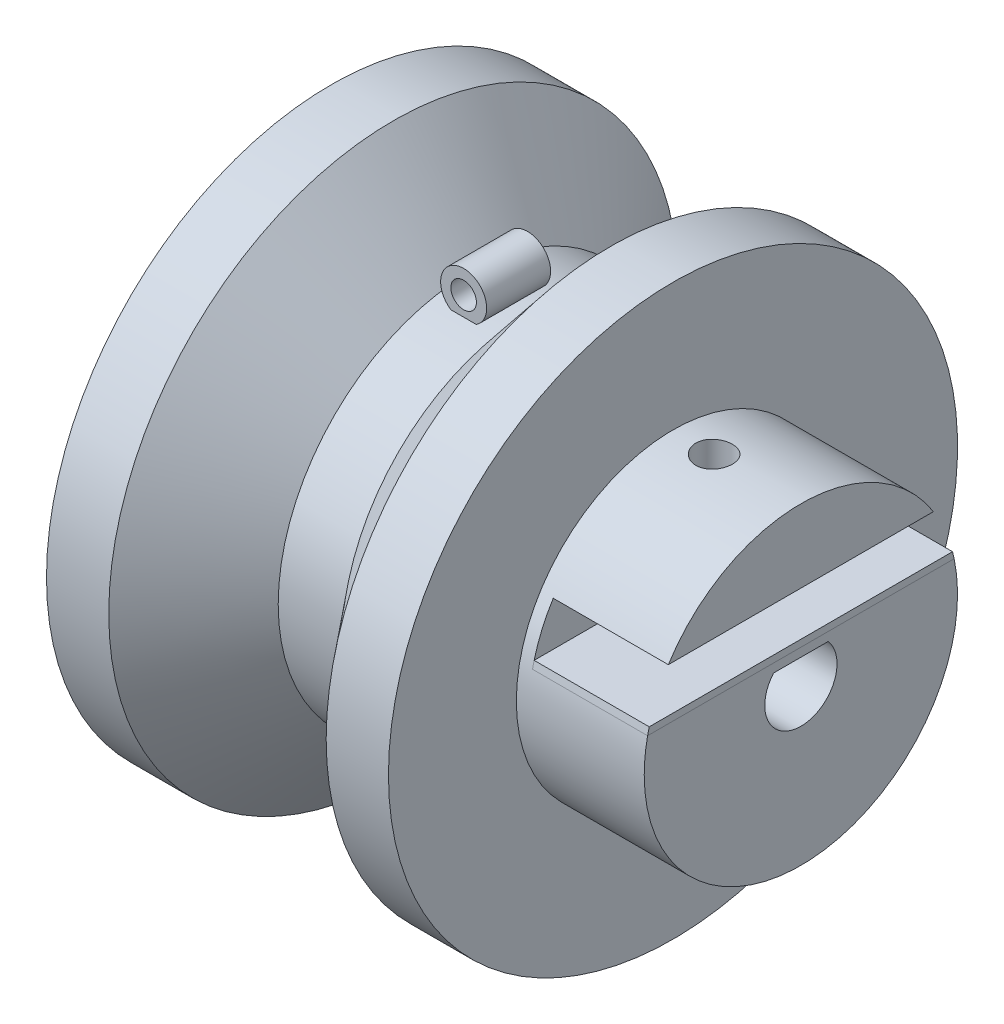
ISO-10303-21;
HEADER;
FILE_DESCRIPTION(('STEP AP214'),'2;1');
FILE_NAME('part.step','',(''),(''),'','','');
FILE_SCHEMA(('AUTOMOTIVE_DESIGN { 1 0 10303 214 1 1 1 1 }'));
ENDSEC;
DATA;
#1=APPLICATION_CONTEXT('core data for automotive mechanical design processes');
#2=APPLICATION_PROTOCOL_DEFINITION('international standard','automotive_design',2000,#1);
#3=PRODUCT_CONTEXT('',#1,'mechanical');
#4=PRODUCT('Part','Part','',(#3));
#5=PRODUCT_RELATED_PRODUCT_CATEGORY('part','',(#4));
#6=PRODUCT_DEFINITION_FORMATION('','',#4);
#7=PRODUCT_DEFINITION_CONTEXT('part definition',#1,'design');
#8=PRODUCT_DEFINITION('design','',#6,#7);
#9=PRODUCT_DEFINITION_SHAPE('','',#8);
#10=(LENGTH_UNIT() NAMED_UNIT(*) SI_UNIT(.MILLI.,.METRE.));
#11=(NAMED_UNIT(*) PLANE_ANGLE_UNIT() SI_UNIT($,.RADIAN.));
#12=(NAMED_UNIT(*) SI_UNIT($,.STERADIAN.) SOLID_ANGLE_UNIT());
#13=UNCERTAINTY_MEASURE_WITH_UNIT(LENGTH_MEASURE(1.E-05),#10,'distance_accuracy_value','');
#14=(GEOMETRIC_REPRESENTATION_CONTEXT(3) GLOBAL_UNCERTAINTY_ASSIGNED_CONTEXT((#13)) GLOBAL_UNIT_ASSIGNED_CONTEXT((#10,
#11,#12)) REPRESENTATION_CONTEXT('',''));
#15=CARTESIAN_POINT('',(0.,0.,0.));
#16=DIRECTION('',(0.,0.,1.));
#17=DIRECTION('',(1.,0.,0.));
#18=AXIS2_PLACEMENT_3D('',#15,#16,#17);
#19=CARTESIAN_POINT('',(27.74,0.,0.));
#20=DIRECTION('',(1.,0.,0.));
#21=DIRECTION('',(0.,0.,-1.));
#22=AXIS2_PLACEMENT_3D('',#19,#20,#21);
#23=PLANE('',#22);
#24=CARTESIAN_POINT('',(27.74,0.,0.));
#25=DIRECTION('',(1.,0.,0.));
#26=DIRECTION('',(0.,0.,-1.));
#27=AXIS2_PLACEMENT_3D('',#24,#25,#26);
#28=CIRCLE('',#27,12.25);
#29=CARTESIAN_POINT('',(27.74,6.53023104767186,10.3642936307315));
#30=VERTEX_POINT('',#29);
#31=CARTESIAN_POINT('',(27.74,3.07105997780226,11.8587980256323));
#32=VERTEX_POINT('',#31);
#33=EDGE_CURVE('E331',#30,#32,#28,.T.);
#34=ORIENTED_EDGE('',*,*,#33,.T.);
#35=DIRECTION('',(0.,0.,1.));
#36=VECTOR('',#35,1.);
#37=CARTESIAN_POINT('',(27.74,3.07105997780226,11.8587980256323));
#38=LINE('',#37,#36);
#39=CARTESIAN_POINT('',(27.74,3.07105997780226,-11.8587980256323));
#40=VERTEX_POINT('',#39);
#41=EDGE_CURVE('E167',#40,#32,#38,.T.);
#42=ORIENTED_EDGE('',*,*,#41,.F.);
#43=CARTESIAN_POINT('',(27.74,6.53023104767186,-10.3642936307315));
#44=VERTEX_POINT('',#43);
#45=EDGE_CURVE('E340',#40,#44,#28,.T.);
#46=ORIENTED_EDGE('',*,*,#45,.T.);
#47=DIRECTION('',(0.,0.,1.));
#48=VECTOR('',#47,1.);
#49=CARTESIAN_POINT('',(27.74,6.53023104767186,12.1510601448769));
#50=LINE('',#49,#48);
#51=EDGE_CURVE('E221',#44,#30,#50,.T.);
#52=ORIENTED_EDGE('',*,*,#51,.T.);
#53=EDGE_LOOP('',(#34,#42,#46,#52));
#54=FACE_BOUND('',#53,.T.);
#55=ADVANCED_FACE('F39',(#54),#23,.T.);
#56=CARTESIAN_POINT('',(-743.156397809563,0.,0.));
#57=DIRECTION('',(-1.,0.,0.));
#58=DIRECTION('',(0.,0.,1.));
#59=AXIS2_PLACEMENT_3D('',#56,#57,#58);
#60=CYLINDRICAL_SURFACE('',#59,15.);
#61=CARTESIAN_POINT('',(15.8700000000001,0.,0.));
#62=DIRECTION('',(-1.,0.,0.));
#63=DIRECTION('',(0.,0.,1.));
#64=AXIS2_PLACEMENT_3D('',#61,#62,#63);
#65=CIRCLE('',#64,15.);
#66=CARTESIAN_POINT('',(15.8700000000001,0.,15.));
#67=VERTEX_POINT('',#66);
#68=EDGE_CURVE('E307',#67,#67,#65,.T.);
#69=ORIENTED_EDGE('',*,*,#68,.T.);
#70=EDGE_LOOP('',(#69));
#71=FACE_BOUND('',#70,.T.);
#72=CARTESIAN_POINT('',(10.87,0.,0.));
#73=DIRECTION('',(-1.,0.,0.));
#74=DIRECTION('',(0.,0.,1.));
#75=AXIS2_PLACEMENT_3D('',#72,#73,#74);
#76=CIRCLE('',#75,15.);
#77=CARTESIAN_POINT('',(10.87,0.,15.));
#78=VERTEX_POINT('',#77);
#79=EDGE_CURVE('E310',#78,#78,#76,.T.);
#80=ORIENTED_EDGE('',*,*,#79,.F.);
#81=EDGE_LOOP('',(#80));
#82=FACE_BOUND('',#81,.T.);
#83=CARTESIAN_POINT('',(14.3603564999786,14.6969384566991,3.));
#84=CARTESIAN_POINT('',(14.375565413541,14.7069638620931,2.9508880576493));
#85=CARTESIAN_POINT('',(14.389981255848,14.7167887801087,2.9014972844901));
#86=CARTESIAN_POINT('',(14.4173840233804,14.7360090205987,2.8022472497741));
#87=CARTESIAN_POINT('',(14.4303712087357,14.745404421097,2.75238807530425));
#88=CARTESIAN_POINT('',(14.4674135259851,14.7728940833375,2.60229504284662));
#89=CARTESIAN_POINT('',(14.4895733341973,14.7903079952818,2.50146652898769));
#90=CARTESIAN_POINT('',(14.5297072187859,14.8231385465529,2.2989276164642));
#91=CARTESIAN_POINT('',(14.5476910197758,14.8385597882394,2.19721985054994));
#92=CARTESIAN_POINT('',(14.5801959164526,14.8673734015254,1.99295118748519));
#93=CARTESIAN_POINT('',(14.5947162298015,14.8807653144882,1.89039010298976));
#94=CARTESIAN_POINT('',(14.6334362145051,14.9174229061922,1.58495578870833));
#95=CARTESIAN_POINT('',(14.6533829903932,14.9376833604889,1.38117127187511));
#96=CARTESIAN_POINT('',(14.6842544861146,14.969872154289,0.972150467194834));
#97=CARTESIAN_POINT('',(14.6951720349504,14.9817938700229,0.766913155749016));
#98=CARTESIAN_POINT('',(14.7094003004623,14.9974511921645,0.34884425116522));
#99=CARTESIAN_POINT('',(14.7124386833097,15.0008935246703,0.135992533654588));
#100=CARTESIAN_POINT('',(14.7104913693555,14.9987135223852,-0.289540702729279));
#101=CARTESIAN_POINT('',(14.7055094747581,14.9930954828781,-0.502222254456071));
#102=CARTESIAN_POINT('',(14.6914946145955,14.9778326803221,-0.822307592393373));
#103=CARTESIAN_POINT('',(14.6856606346637,14.9715289064718,-0.930026405298139));
#104=CARTESIAN_POINT('',(14.6715739023669,14.9566128084705,-1.14514430830223));
#105=CARTESIAN_POINT('',(14.663321275191,14.9480006038058,-1.25254341465898));
#106=CARTESIAN_POINT('',(14.6441400084482,14.9284815015849,-1.46698172875957));
#107=CARTESIAN_POINT('',(14.6332092883847,14.917572820926,-1.57402059079182));
#108=CARTESIAN_POINT('',(14.6082830901067,14.8935015574268,-1.78750352998333));
#109=CARTESIAN_POINT('',(14.5942870783315,14.8803385822793,-1.89394750028052));
#110=CARTESIAN_POINT('',(14.5785641948691,14.8660687473185,-2.));
#111=B_SPLINE_CURVE_WITH_KNOTS('',3,(#83,#84,#85,#86,#87,#88,#89,#90,#91,#92,#93,#94,#95,#96,
#97,#98,#99,#100,#101,#102,#103,#104,#105,#106,#107,#108,#109,#110),.UNSPECIFIED.,.F.,.F.,(4,2,
2,2,2,2,2,2,2,2,2,2,2,4),(0.,0.157125421520039,0.314222186121996,0.628163323712242,
0.941365890364293,1.25463913684611,1.87144336455489,2.48873698804712,3.12709849295068,
3.76515745642442,4.08929701255501,4.41341979420339,4.73779517592428,5.06222706505501),.UNSPECIFIED.);
#112=CARTESIAN_POINT('',(14.3603564999786,14.6969384566991,3.));
#113=VERTEX_POINT('',#112);
#114=CARTESIAN_POINT('',(14.5785641948691,14.8660687473185,-2.));
#115=VERTEX_POINT('',#114);
#116=EDGE_CURVE('E12',#113,#115,#111,.T.);
#117=ORIENTED_EDGE('',*,*,#116,.F.);
#118=DIRECTION('',(-1.,0.,0.));
#119=VECTOR('',#118,1.);
#120=CARTESIAN_POINT('',(-743.156397809563,14.6969384566991,3.));
#121=LINE('',#120,#119);
#122=CARTESIAN_POINT('',(12.3796435000215,14.6969384566991,3.));
#123=VERTEX_POINT('',#122);
#124=EDGE_CURVE('E50',#113,#123,#121,.T.);
#125=ORIENTED_EDGE('',*,*,#124,.T.);
#126=CARTESIAN_POINT('',(12.161435805131,14.8660687473185,-2.));
#127=CARTESIAN_POINT('',(12.1510449556833,14.8754873074905,-1.92999392595593));
#128=CARTESIAN_POINT('',(12.1414190339191,14.8844250221794,-1.85981475070133));
#129=CARTESIAN_POINT('',(12.1235666250048,14.9013247961275,-1.71916663533562));
#130=CARTESIAN_POINT('',(12.1153400310254,14.9092869298526,-1.64869771776544));
#131=CARTESIAN_POINT('',(12.0925661470756,14.9316864446193,-1.43696858732993));
#132=CARTESIAN_POINT('',(12.0799184888838,14.944642782673,-1.29534262137741));
#133=CARTESIAN_POINT('',(12.0589689193887,14.9665395696335,-1.01142357675604));
#134=CARTESIAN_POINT('',(12.0506684835147,14.9754786549555,-0.869130288111088));
#135=CARTESIAN_POINT('',(12.0379742640885,14.9892996466891,-0.584162983500658));
#136=CARTESIAN_POINT('',(12.0335807824523,14.9941812395495,-0.441488938966009));
#137=CARTESIAN_POINT('',(12.0285280530927,14.9998056792203,-0.159142873671705));
#138=CARTESIAN_POINT('',(12.027788620297,15.0006373912555,-0.0194740094261576));
#139=CARTESIAN_POINT('',(12.0297911681509,14.9983999246762,0.259807355729154));
#140=CARTESIAN_POINT('',(12.0325331262388,14.9953307713418,0.399419856998323));
#141=CARTESIAN_POINT('',(12.0416340445548,14.9853025084915,0.678368684687267));
#142=CARTESIAN_POINT('',(12.0479924890778,14.9783439536004,0.817705047641759));
#143=CARTESIAN_POINT('',(12.064647076979,14.9605633718249,1.09588533701485));
#144=CARTESIAN_POINT('',(12.0749428128191,14.9497417448041,1.23472931289838));
#145=CARTESIAN_POINT('',(12.0999332843427,14.9243644783994,1.51077212763931));
#146=CARTESIAN_POINT('',(12.1145992250133,14.9098333677344,1.64797580159478));
#147=CARTESIAN_POINT('',(12.149145546532,14.8770918056127,1.92121020371177));
#148=CARTESIAN_POINT('',(12.1690223929757,14.8588838499674,2.05724166260286));
#149=CARTESIAN_POINT('',(12.2037845080863,14.8288049311169,2.26082404050611));
#150=CARTESIAN_POINT('',(12.2162793912009,14.8182513131123,2.32898274837038));
#151=CARTESIAN_POINT('',(12.2431286725191,14.7962684011796,2.46478634203883));
#152=CARTESIAN_POINT('',(12.257482878078,14.7848391980211,2.53243128030713));
#153=CARTESIAN_POINT('',(12.2883297295458,14.7611212613452,2.66720529660188));
#154=CARTESIAN_POINT('',(12.3048258483161,14.7488311471983,2.73433334511795));
#155=CARTESIAN_POINT('',(12.3402922539281,14.7234615883733,2.86780561417045));
#156=CARTESIAN_POINT('',(12.3592634109102,14.7103818669689,2.93414955005096));
#157=CARTESIAN_POINT('',(12.3796435000215,14.6969384566991,3.));
#158=B_SPLINE_CURVE_WITH_KNOTS('',3,(#126,#127,#128,#129,#130,#131,#132,#133,#134,#135,#136,
#137,#138,#139,#140,#141,#142,#143,#144,#145,#146,#147,#148,#149,#150,#151,#152,#153,#154,#155,
#156,#157),.UNSPECIFIED.,.F.,.F.,(4,2,2,2,2,2,2,2,2,2,2,2,2,2,2,4),(0.,0.214176567922953,
0.428336777552436,0.856524687719513,1.28485782907508,1.71322406767643,2.1321470888544,
2.55106739514141,2.96992797904157,3.388745219578,3.80486172331032,4.22069671440474,
4.43095147937188,4.64118447721499,4.8517627021381,5.06241515980513),.UNSPECIFIED.);
#159=CARTESIAN_POINT('',(12.161435805131,14.8660687473185,-2.));
#160=VERTEX_POINT('',#159);
#161=EDGE_CURVE('E343',#160,#123,#158,.T.);
#162=ORIENTED_EDGE('',*,*,#161,.F.);
#163=DIRECTION('',(-1.,0.,0.));
#164=VECTOR('',#163,1.);
#165=CARTESIAN_POINT('',(-743.156397809563,14.8660687473185,-2.));
#166=LINE('',#165,#164);
#167=EDGE_CURVE('E61',#115,#160,#166,.T.);
#168=ORIENTED_EDGE('',*,*,#167,.F.);
#169=EDGE_LOOP('',(#117,#125,#162,#168));
#170=FACE_BOUND('',#169,.T.);
#171=ADVANCED_FACE('F240',(#71,#82,#170),#60,.T.);
#172=CARTESIAN_POINT('',(36.74,12.25,0.));
#173=DIRECTION('',(-1.,0.,0.));
#174=DIRECTION('',(0.,0.,1.));
#175=AXIS2_PLACEMENT_3D('',#172,#173,#174);
#176=PLANE('',#175);
#177=DIRECTION('',(0.,0.,-1.));
#178=VECTOR('',#177,1.);
#179=CARTESIAN_POINT('',(36.74,1.85097792377277,2.60998384332674));
#180=LINE('',#179,#178);
#181=CARTESIAN_POINT('',(36.74,1.85097792377277,2.13412879782497));
#182=VERTEX_POINT('',#181);
#183=CARTESIAN_POINT('',(36.74,1.85097792377277,-2.13412879782497));
#184=VERTEX_POINT('',#183);
#185=EDGE_CURVE('E284',#182,#184,#180,.T.);
#186=ORIENTED_EDGE('',*,*,#185,.T.);
#187=CARTESIAN_POINT('',(36.74,0.,0.));
#188=DIRECTION('',(1.,0.,0.));
#189=DIRECTION('',(0.,0.,-1.));
#190=AXIS2_PLACEMENT_3D('',#187,#188,#189);
#191=CIRCLE('',#190,2.825);
#192=EDGE_CURVE('E295',#182,#184,#191,.T.);
#193=ORIENTED_EDGE('',*,*,#192,.F.);
#194=EDGE_LOOP('',(#186,#193));
#195=FACE_BOUND('',#194,.T.);
#196=CARTESIAN_POINT('',(36.74,0.,0.));
#197=DIRECTION('',(-1.,0.,0.));
#198=DIRECTION('',(0.,0.,1.));
#199=AXIS2_PLACEMENT_3D('',#196,#197,#198);
#200=CIRCLE('',#199,12.25);
#201=CARTESIAN_POINT('',(36.74,2.53023104767186,-11.985842934287));
#202=VERTEX_POINT('',#201);
#203=CARTESIAN_POINT('',(36.74,2.53023104767186,11.985842934287));
#204=VERTEX_POINT('',#203);
#205=EDGE_CURVE('E287',#202,#204,#200,.T.);
#206=ORIENTED_EDGE('',*,*,#205,.F.);
#207=DIRECTION('',(0.,0.,1.));
#208=VECTOR('',#207,1.);
#209=CARTESIAN_POINT('',(36.74,2.53023104767186,0.));
#210=LINE('',#209,#208);
#211=EDGE_CURVE('E146',#202,#204,#210,.T.);
#212=ORIENTED_EDGE('',*,*,#211,.T.);
#213=EDGE_LOOP('',(#206,#212));
#214=FACE_BOUND('',#213,.T.);
#215=ADVANCED_FACE('F263',(#195,#214),#176,.F.);
#216=CARTESIAN_POINT('',(0.,0.,0.));
#217=DIRECTION('',(1.,0.,0.));
#218=DIRECTION('',(0.,0.,-1.));
#219=AXIS2_PLACEMENT_3D('',#216,#217,#218);
#220=PLANE('',#219);
#221=CARTESIAN_POINT('',(0.,0.,0.));
#222=DIRECTION('',(-1.,0.,0.));
#223=DIRECTION('',(0.,0.,1.));
#224=AXIS2_PLACEMENT_3D('',#221,#222,#223);
#225=CIRCLE('',#224,22.25);
#226=CARTESIAN_POINT('',(0.,0.,22.25));
#227=VERTEX_POINT('',#226);
#228=EDGE_CURVE('E316',#227,#227,#225,.T.);
#229=ORIENTED_EDGE('',*,*,#228,.T.);
#230=EDGE_LOOP('',(#229));
#231=FACE_BOUND('',#230,.T.);
#232=ADVANCED_FACE('F41',(#231),#220,.F.);
#233=CARTESIAN_POINT('',(-743.156397809563,0.,0.));
#234=DIRECTION('',(-1.,0.,0.));
#235=DIRECTION('',(0.,0.,1.));
#236=AXIS2_PLACEMENT_3D('',#233,#234,#235);
#237=CYLINDRICAL_SURFACE('',#236,22.25);
#238=ORIENTED_EDGE('',*,*,#228,.F.);
#239=EDGE_LOOP('',(#238));
#240=FACE_BOUND('',#239,.T.);
#241=CARTESIAN_POINT('',(4.87000000000004,0.,0.));
#242=DIRECTION('',(-1.,0.,0.));
#243=DIRECTION('',(0.,0.,1.));
#244=AXIS2_PLACEMENT_3D('',#241,#242,#243);
#245=CIRCLE('',#244,22.25);
#246=CARTESIAN_POINT('',(4.87000000000004,0.,22.25));
#247=VERTEX_POINT('',#246);
#248=EDGE_CURVE('E313',#247,#247,#245,.T.);
#249=ORIENTED_EDGE('',*,*,#248,.T.);
#250=EDGE_LOOP('',(#249));
#251=FACE_BOUND('',#250,.T.);
#252=ADVANCED_FACE('F276',(#240,#251),#237,.T.);
#253=CARTESIAN_POINT('',(10.87,0.,0.));
#254=DIRECTION('',(-1.,0.,0.));
#255=DIRECTION('',(0.,0.,1.));
#256=AXIS2_PLACEMENT_3D('',#253,#254,#255);
#257=CONICAL_SURFACE('',#256,15.,0.879459398025434);
#258=ORIENTED_EDGE('',*,*,#248,.F.);
#259=EDGE_LOOP('',(#258));
#260=FACE_BOUND('',#259,.T.);
#261=ORIENTED_EDGE('',*,*,#79,.T.);
#262=EDGE_LOOP('',(#261));
#263=FACE_BOUND('',#262,.T.);
#264=ADVANCED_FACE('F389',(#260,#263),#257,.T.);
#265=CARTESIAN_POINT('',(21.8699999999999,0.,0.));
#266=DIRECTION('',(1.,0.,0.));
#267=DIRECTION('',(0.,0.,-1.));
#268=AXIS2_PLACEMENT_3D('',#265,#266,#267);
#269=CONICAL_SURFACE('',#268,22.25,0.879459398025443);
#270=ORIENTED_EDGE('',*,*,#68,.F.);
#271=EDGE_LOOP('',(#270));
#272=FACE_BOUND('',#271,.T.);
#273=CARTESIAN_POINT('',(21.8699999999999,0.,0.));
#274=DIRECTION('',(-1.,0.,0.));
#275=DIRECTION('',(0.,0.,1.));
#276=AXIS2_PLACEMENT_3D('',#273,#274,#275);
#277=CIRCLE('',#276,22.25);
#278=CARTESIAN_POINT('',(21.8699999999999,0.,22.25));
#279=VERTEX_POINT('',#278);
#280=EDGE_CURVE('E304',#279,#279,#277,.T.);
#281=ORIENTED_EDGE('',*,*,#280,.T.);
#282=EDGE_LOOP('',(#281));
#283=FACE_BOUND('',#282,.T.);
#284=ADVANCED_FACE('F387',(#272,#283),#269,.T.);
#285=CARTESIAN_POINT('',(-743.156397809563,0.,0.));
#286=DIRECTION('',(-1.,0.,0.));
#287=DIRECTION('',(0.,0.,1.));
#288=AXIS2_PLACEMENT_3D('',#285,#286,#287);
#289=CYLINDRICAL_SURFACE('',#288,22.25);
#290=ORIENTED_EDGE('',*,*,#280,.F.);
#291=EDGE_LOOP('',(#290));
#292=FACE_BOUND('',#291,.T.);
#293=CARTESIAN_POINT('',(26.74,0.,0.));
#294=DIRECTION('',(-1.,0.,0.));
#295=DIRECTION('',(0.,0.,1.));
#296=AXIS2_PLACEMENT_3D('',#293,#294,#295);
#297=CIRCLE('',#296,22.25);
#298=CARTESIAN_POINT('',(26.74,0.,22.25));
#299=VERTEX_POINT('',#298);
#300=EDGE_CURVE('E301',#299,#299,#297,.T.);
#301=ORIENTED_EDGE('',*,*,#300,.T.);
#302=EDGE_LOOP('',(#301));
#303=FACE_BOUND('',#302,.T.);
#304=ADVANCED_FACE('F498',(#292,#303),#289,.T.);
#305=CARTESIAN_POINT('',(26.74,22.25,0.));
#306=DIRECTION('',(-1.,0.,0.));
#307=DIRECTION('',(0.,0.,1.));
#308=AXIS2_PLACEMENT_3D('',#305,#306,#307);
#309=PLANE('',#308);
#310=ORIENTED_EDGE('',*,*,#300,.F.);
#311=EDGE_LOOP('',(#310));
#312=FACE_BOUND('',#311,.T.);
#313=CARTESIAN_POINT('',(26.74,0.,0.));
#314=DIRECTION('',(-1.,0.,0.));
#315=DIRECTION('',(0.,0.,1.));
#316=AXIS2_PLACEMENT_3D('',#313,#314,#315);
#317=CIRCLE('',#316,12.25);
#318=CARTESIAN_POINT('',(26.74,0.,12.25));
#319=VERTEX_POINT('',#318);
#320=EDGE_CURVE('E293',#319,#319,#317,.T.);
#321=ORIENTED_EDGE('',*,*,#320,.T.);
#322=EDGE_LOOP('',(#321));
#323=FACE_BOUND('',#322,.T.);
#324=ADVANCED_FACE('F268',(#312,#323),#309,.F.);
#325=CARTESIAN_POINT('',(-743.156397809563,0.,0.));
#326=DIRECTION('',(-1.,0.,0.));
#327=DIRECTION('',(0.,0.,1.));
#328=AXIS2_PLACEMENT_3D('',#325,#326,#327);
#329=CYLINDRICAL_SURFACE('',#328,12.25);
#330=CARTESIAN_POINT('',(29.9566790366801,12.1662483946367,1.43));
#331=CARTESIAN_POINT('',(29.8766494599082,12.1662494764785,1.42999657319985));
#332=CARTESIAN_POINT('',(29.7965688339633,12.1670465671756,1.4232590938954));
#333=CARTESIAN_POINT('',(29.6386332544761,12.1701478720551,1.39648679453404));
#334=CARTESIAN_POINT('',(29.5607807640223,12.1724536916248,1.37643780981985));
#335=CARTESIAN_POINT('',(29.4096111468226,12.1783077992069,1.32363900799406));
#336=CARTESIAN_POINT('',(29.3362910948515,12.1818552757947,1.29089748397542));
#337=CARTESIAN_POINT('',(29.1962009354038,12.189792001989,1.21366015575235));
#338=CARTESIAN_POINT('',(29.1294296471115,12.1941810994186,1.16916647595705));
#339=CARTESIAN_POINT('',(29.0039908018155,12.2033306141202,1.06945411979111));
#340=CARTESIAN_POINT('',(28.9453599418034,12.2080925705699,1.01418941469083));
#341=CARTESIAN_POINT('',(28.8381829267878,12.2174373686309,0.894602662400792));
#342=CARTESIAN_POINT('',(28.7896372588966,12.2220202015818,0.830280177974182));
#343=CARTESIAN_POINT('',(28.7038784872012,12.2305059835631,0.694174859730991));
#344=CARTESIAN_POINT('',(28.6666983713235,12.2344069397099,0.622371105689862));
#345=CARTESIAN_POINT('',(28.6049373026696,12.2410725701386,0.47348598568523));
#346=CARTESIAN_POINT('',(28.5803559394547,12.2438372814361,0.396404791741479));
#347=CARTESIAN_POINT('',(28.5445991796129,12.2479080842327,0.239526887499047));
#348=CARTESIAN_POINT('',(28.5333629795262,12.2492207894915,0.159744210325316));
#349=CARTESIAN_POINT('',(28.5244271680385,12.250262229114,-0.00058447547828128));
#350=CARTESIAN_POINT('',(28.5267270884349,12.249991018264,-0.0811304576098837));
#351=CARTESIAN_POINT('',(28.5447492816744,12.2479005561685,-0.240285990714949));
#352=CARTESIAN_POINT('',(28.5604061664309,12.2460888464694,-0.318903058952142));
#353=CARTESIAN_POINT('',(28.6045957554724,12.2411294834295,-0.472386056833472));
#354=CARTESIAN_POINT('',(28.6331286777041,12.2379818074754,-0.547251922958906));
#355=CARTESIAN_POINT('',(28.7023306961738,12.2306912608596,-0.691311087857823));
#356=CARTESIAN_POINT('',(28.7430283154615,12.2265460557537,-0.760490562015241));
#357=CARTESIAN_POINT('',(28.8353837385036,12.2177247027813,-0.891062369789983));
#358=CARTESIAN_POINT('',(28.8870419807568,12.2130485336761,-0.952454391699639));
#359=CARTESIAN_POINT('',(29.0002190344858,12.2036561839414,-1.06609234657618));
#360=CARTESIAN_POINT('',(29.0617947964166,12.1989399309762,-1.1182815705376));
#361=CARTESIAN_POINT('',(29.1928627021825,12.1900265826412,-1.21159233233518));
#362=CARTESIAN_POINT('',(29.2623548654631,12.1858294885467,-1.25271384298425));
#363=CARTESIAN_POINT('',(29.4073310059708,12.1784295921188,-1.32272387799844));
#364=CARTESIAN_POINT('',(29.4828170167239,12.175227129058,-1.35160822943799));
#365=CARTESIAN_POINT('',(29.6376135073783,12.1701858702963,-1.39627566579482));
#366=CARTESIAN_POINT('',(29.7169238270989,12.1683470175334,-1.41205929893063));
#367=CARTESIAN_POINT('',(29.8766178259339,12.166251444438,-1.43000292420034));
#368=CARTESIAN_POINT('',(29.9569924399195,12.1659854756689,-1.43224255578196));
#369=CARTESIAN_POINT('',(30.1169717476356,12.167041346673,-1.42324438624569));
#370=CARTESIAN_POINT('',(30.1965764556038,12.1683631570269,-1.41200683484079));
#371=CARTESIAN_POINT('',(30.3525199265587,12.1724372236261,-1.3764401979371));
#372=CARTESIAN_POINT('',(30.4288675298548,12.1751853006869,-1.35214935330823));
#373=CARTESIAN_POINT('',(30.5764054941845,12.1817988777227,-1.29120490605895));
#374=CARTESIAN_POINT('',(30.6475956960341,12.1856644121697,-1.25455092204586));
#375=CARTESIAN_POINT('',(30.7831592990155,12.1940995993511,-1.16972355044955));
#376=CARTESIAN_POINT('',(30.8474996982672,12.1986724215983,-1.1214977424095));
#377=CARTESIAN_POINT('',(30.9672013148141,12.2079968509208,-1.01497014305004));
#378=CARTESIAN_POINT('',(31.0225622281071,12.2127484640425,-0.956668010732705));
#379=CARTESIAN_POINT('',(31.1230113227682,12.221923332523,-0.831295695579889));
#380=CARTESIAN_POINT('',(31.1680473061693,12.2263448463807,-0.764183545904372));
#381=CARTESIAN_POINT('',(31.2462076676495,12.2343355470401,-0.623301478623578));
#382=CARTESIAN_POINT('',(31.2793322591886,12.2379047491154,-0.549531680357399));
#383=CARTESIAN_POINT('',(31.3326425536373,12.2437809020944,-0.397604915583706));
#384=CARTESIAN_POINT('',(31.352858903765,12.2460908408643,-0.31945882333714));
#385=CARTESIAN_POINT('',(31.3798786678111,12.2492005588215,-0.160852789143606));
#386=CARTESIAN_POINT('',(31.3866826054276,12.2500003969718,-0.0803929376636327));
#387=CARTESIAN_POINT('',(31.3866754861433,12.2499996050373,0.080045928678768));
#388=CARTESIAN_POINT('',(31.3799451062275,12.2492084586831,0.160024959252834));
#389=CARTESIAN_POINT('',(31.3532306721108,12.2461333819522,0.317707299122562));
#390=CARTESIAN_POINT('',(31.3332466193482,12.2438494517374,0.395410608665193));
#391=CARTESIAN_POINT('',(31.2806164236349,12.2380444106345,0.546328691399993));
#392=CARTESIAN_POINT('',(31.2479736240718,12.2345236264432,0.619544643870412));
#393=CARTESIAN_POINT('',(31.1709609211074,12.2266356563669,0.7594718693999));
#394=CARTESIAN_POINT('',(31.1265909511177,12.2222684656758,0.826183105521381));
#395=CARTESIAN_POINT('',(31.027083246204,12.2131446950015,0.951619997963088));
#396=CARTESIAN_POINT('',(30.9718854144298,12.2083860320232,1.01029783078927));
#397=CARTESIAN_POINT('',(30.8524122309265,12.1990327182708,1.11759078287257));
#398=CARTESIAN_POINT('',(30.7881347233288,12.1944381067744,1.16620350550182));
#399=CARTESIAN_POINT('',(30.6520806621366,12.1859165507155,1.25212377536674));
#400=CARTESIAN_POINT('',(30.5802794902359,12.1819919159378,1.28939254608345));
#401=CARTESIAN_POINT('',(30.4314342252443,12.1752818462602,1.35129200655654));
#402=CARTESIAN_POINT('',(30.3543960164049,12.1724951566768,1.37593662321383));
#403=CARTESIAN_POINT('',(30.2235675584141,12.1690624705916,1.40590035862611));
#404=CARTESIAN_POINT('',(30.1706067755839,12.1680123524617,1.41492496017582));
#405=CARTESIAN_POINT('',(30.0639979910831,12.1666049538996,1.4269759110792));
#406=CARTESIAN_POINT('',(30.0103499937353,12.1662476691113,1.4300022981459));
#407=CARTESIAN_POINT('',(29.9566790366801,12.1662483946367,1.43));
#408=B_SPLINE_CURVE_WITH_KNOTS('',3,(#330,#331,#332,#333,#334,#335,#336,#337,#338,#339,#340,
#341,#342,#343,#344,#345,#346,#347,#348,#349,#350,#351,#352,#353,#354,#355,#356,#357,#358,#359,
#360,#361,#362,#363,#364,#365,#366,#367,#368,#369,#370,#371,#372,#373,#374,#375,#376,#377,#378,
#379,#380,#381,#382,#383,#384,#385,#386,#387,#388,#389,#390,#391,#392,#393,#394,#395,#396,#397,
#398,#399,#400,#401,#402,#403,#404,#405,#406,#407),.UNSPECIFIED.,.T.,.F.,(4,2,2,2,2,2,2,2,2,2,2,
2,2,2,2,2,2,2,2,2,2,2,2,2,2,2,2,2,2,2,2,2,2,2,2,2,2,2,4),(0.,0.239892687998416,
0.480041053710676,0.720032774243452,0.959981141701432,1.20097831998869,1.441987135675,
1.68368896678438,1.92538292329661,2.16597139279282,2.40655154059297,2.64596065924562,
2.88537383041814,3.1253528265138,3.36534142519864,3.60676078286088,3.84818073354809,
4.08968294337488,4.33117504668258,4.57124577202616,4.81131204927001,5.05067883328292,
5.29005300223942,5.53053271952769,5.77102057660469,6.0126986588469,6.25437240984254,
6.4954702154024,6.73655860692459,6.97621414988031,7.21586966682763,7.45546192979213,
7.69505555322255,7.93601864687917,8.1770390510256,8.41887430416094,8.6604421882055,
8.82132459727467,8.98220599481256),.UNSPECIFIED.);
#409=CARTESIAN_POINT('',(29.9566790366801,12.1662483946367,1.43));
#410=VERTEX_POINT('',#409);
#411=EDGE_CURVE('E215',#410,#410,#408,.T.);
#412=ORIENTED_EDGE('',*,*,#411,.T.);
#413=EDGE_LOOP('',(#412));
#414=FACE_BOUND('',#413,.T.);
#415=CARTESIAN_POINT('',(27.74,2.53023104767186,-11.985842934287));
#416=DIRECTION('',(0.,0.973500960801579,0.228682923101842));
#417=VECTOR('',#416,1.);
#418=LINE('',#415,#417);
#419=CARTESIAN_POINT('',(27.74,2.53023104767186,-11.985842934287));
#420=VERTEX_POINT('',#419);
#421=EDGE_CURVE('E352',#420,#40,#418,.T.);
#422=ORIENTED_EDGE('',*,*,#421,.F.);
#423=DIRECTION('',(1.,0.,0.));
#424=VECTOR('',#423,1.);
#425=CARTESIAN_POINT('',(27.74,2.53023104767186,-11.985842934287));
#426=LINE('',#425,#424);
#427=EDGE_CURVE('E346',#420,#202,#426,.T.);
#428=ORIENTED_EDGE('',*,*,#427,.T.);
#429=ORIENTED_EDGE('',*,*,#205,.T.);
#430=DIRECTION('',(-1.,0.,0.));
#431=VECTOR('',#430,1.);
#432=CARTESIAN_POINT('',(-743.156397809563,2.53023104767186,11.985842934287));
#433=LINE('',#432,#431);
#434=CARTESIAN_POINT('',(27.74,2.53023104767186,11.985842934287));
#435=VERTEX_POINT('',#434);
#436=EDGE_CURVE('E361',#204,#435,#433,.T.);
#437=ORIENTED_EDGE('',*,*,#436,.T.);
#438=CARTESIAN_POINT('',(27.74,3.07105997780226,11.8587980256323));
#439=DIRECTION('',(0.,-0.973500960801579,0.228682923101843));
#440=VECTOR('',#439,1.);
#441=LINE('',#438,#440);
#442=EDGE_CURVE('E142',#32,#435,#441,.T.);
#443=ORIENTED_EDGE('',*,*,#442,.F.);
#444=ORIENTED_EDGE('',*,*,#33,.F.);
#445=DIRECTION('',(-1.,0.,0.));
#446=VECTOR('',#445,1.);
#447=CARTESIAN_POINT('',(-743.156397809563,6.53023104767186,10.3642936307315));
#448=LINE('',#447,#446);
#449=CARTESIAN_POINT('',(36.74,6.53023104767186,10.3642936307315));
#450=VERTEX_POINT('',#449);
#451=EDGE_CURVE('E348',#30,#450,#448,.F.);
#452=ORIENTED_EDGE('',*,*,#451,.T.);
#453=CARTESIAN_POINT('',(36.74,6.53023104767186,-10.3642936307315));
#454=VERTEX_POINT('',#453);
#455=EDGE_CURVE('E289',#450,#454,#200,.T.);
#456=ORIENTED_EDGE('',*,*,#455,.T.);
#457=DIRECTION('',(-1.,0.,0.));
#458=VECTOR('',#457,1.);
#459=CARTESIAN_POINT('',(-743.156397809563,6.53023104767186,-10.3642936307315));
#460=LINE('',#459,#458);
#461=EDGE_CURVE('E365',#454,#44,#460,.T.);
#462=ORIENTED_EDGE('',*,*,#461,.T.);
#463=ORIENTED_EDGE('',*,*,#45,.F.);
#464=EDGE_LOOP('',(#422,#428,#429,#437,#443,#444,#452,#456,#462,#463));
#465=FACE_BOUND('',#464,.T.);
#466=ORIENTED_EDGE('',*,*,#320,.F.);
#467=EDGE_LOOP('',(#466));
#468=FACE_BOUND('',#467,.T.);
#469=ADVANCED_FACE('F223',(#414,#465,#468),#329,.T.);
#470=ORIENTED_EDGE('',*,*,#455,.F.);
#471=DIRECTION('',(0.,0.,-1.));
#472=VECTOR('',#471,1.);
#473=CARTESIAN_POINT('',(36.74,6.53023104767186,0.));
#474=LINE('',#473,#472);
#475=EDGE_CURVE('E327',#450,#454,#474,.T.);
#476=ORIENTED_EDGE('',*,*,#475,.T.);
#477=EDGE_LOOP('',(#470,#476));
#478=FACE_BOUND('',#477,.T.);
#479=ADVANCED_FACE('F259',(#478),#176,.F.);
#480=CARTESIAN_POINT('',(1.74,0.,0.));
#481=DIRECTION('',(1.,0.,0.));
#482=DIRECTION('',(0.,0.,-1.));
#483=AXIS2_PLACEMENT_3D('',#480,#481,#482);
#484=CYLINDRICAL_SURFACE('',#483,2.825);
#485=ORIENTED_EDGE('',*,*,#192,.T.);
#486=DIRECTION('',(1.,0.,0.));
#487=VECTOR('',#486,1.);
#488=CARTESIAN_POINT('',(1.74,1.85097792377277,-2.13412879782497));
#489=LINE('',#488,#487);
#490=CARTESIAN_POINT('',(6.74,1.85097792377277,-2.13412879782497));
#491=VERTEX_POINT('',#490);
#492=EDGE_CURVE('E324',#184,#491,#489,.F.);
#493=ORIENTED_EDGE('',*,*,#492,.T.);
#494=CARTESIAN_POINT('',(6.74,0.,0.));
#495=DIRECTION('',(1.,0.,0.));
#496=DIRECTION('',(0.,0.,-1.));
#497=AXIS2_PLACEMENT_3D('',#494,#495,#496);
#498=CIRCLE('',#497,2.825);
#499=CARTESIAN_POINT('',(6.74,1.85097792377277,2.13412879782497));
#500=VERTEX_POINT('',#499);
#501=EDGE_CURVE('E319',#500,#491,#498,.F.);
#502=ORIENTED_EDGE('',*,*,#501,.F.);
#503=DIRECTION('',(1.,0.,0.));
#504=VECTOR('',#503,1.);
#505=CARTESIAN_POINT('',(1.74,1.85097792377277,2.13412879782497));
#506=LINE('',#505,#504);
#507=EDGE_CURVE('E321',#500,#182,#506,.T.);
#508=ORIENTED_EDGE('',*,*,#507,.T.);
#509=EDGE_LOOP('',(#485,#493,#502,#508));
#510=FACE_BOUND('',#509,.T.);
#511=CARTESIAN_POINT('',(1.74,0.,0.));
#512=DIRECTION('',(1.,0.,0.));
#513=DIRECTION('',(0.,0.,-1.));
#514=AXIS2_PLACEMENT_3D('',#511,#512,#513);
#515=CIRCLE('',#514,2.825);
#516=CARTESIAN_POINT('',(1.74,0.,-2.825));
#517=VERTEX_POINT('',#516);
#518=EDGE_CURVE('E290',#517,#517,#515,.T.);
#519=ORIENTED_EDGE('',*,*,#518,.F.);
#520=EDGE_LOOP('',(#519));
#521=FACE_BOUND('',#520,.T.);
#522=ADVANCED_FACE('F256',(#510,#521),#484,.F.);
#523=CARTESIAN_POINT('',(1.74,0.,0.));
#524=DIRECTION('',(1.,0.,0.));
#525=DIRECTION('',(0.,0.,-1.));
#526=AXIS2_PLACEMENT_3D('',#523,#524,#525);
#527=PLANE('',#526);
#528=ORIENTED_EDGE('',*,*,#518,.T.);
#529=EDGE_LOOP('',(#528));
#530=FACE_BOUND('',#529,.T.);
#531=ADVANCED_FACE('F252',(#530),#527,.T.);
#532=CARTESIAN_POINT('',(6.74,1.85097792377277,2.60998384332674));
#533=DIRECTION('',(0.,-1.,0.));
#534=DIRECTION('',(0.,0.,-1.));
#535=AXIS2_PLACEMENT_3D('',#532,#533,#534);
#536=PLANE('',#535);
#537=CARTESIAN_POINT('',(29.9566790366801,1.85097792377277,0.));
#538=DIRECTION('',(0.,-1.,0.));
#539=DIRECTION('',(0.,0.,-1.));
#540=AXIS2_PLACEMENT_3D('',#537,#538,#539);
#541=CIRCLE('',#540,1.43);
#542=CARTESIAN_POINT('',(29.9566790366801,1.85097792377277,-1.43));
#543=VERTEX_POINT('',#542);
#544=EDGE_CURVE('E212',#543,#543,#541,.T.);
#545=ORIENTED_EDGE('',*,*,#544,.F.);
#546=EDGE_LOOP('',(#545));
#547=FACE_BOUND('',#546,.T.);
#548=ORIENTED_EDGE('',*,*,#492,.F.);
#549=ORIENTED_EDGE('',*,*,#185,.F.);
#550=ORIENTED_EDGE('',*,*,#507,.F.);
#551=DIRECTION('',(0.,0.,-1.));
#552=VECTOR('',#551,1.);
#553=CARTESIAN_POINT('',(6.74,1.85097792377277,2.60998384332674));
#554=LINE('',#553,#552);
#555=EDGE_CURVE('E369',#500,#491,#554,.T.);
#556=ORIENTED_EDGE('',*,*,#555,.T.);
#557=EDGE_LOOP('',(#548,#549,#550,#556));
#558=FACE_BOUND('',#557,.T.);
#559=ADVANCED_FACE('F248',(#547,#558),#536,.T.);
#560=CARTESIAN_POINT('',(6.74,0.,0.));
#561=DIRECTION('',(1.,0.,0.));
#562=DIRECTION('',(0.,0.,-1.));
#563=AXIS2_PLACEMENT_3D('',#560,#561,#562);
#564=PLANE('',#563);
#565=ORIENTED_EDGE('',*,*,#501,.T.);
#566=ORIENTED_EDGE('',*,*,#555,.F.);
#567=EDGE_LOOP('',(#565,#566));
#568=FACE_BOUND('',#567,.T.);
#569=ADVANCED_FACE('F244',(#568),#564,.F.);
#570=CARTESIAN_POINT('',(27.74,6.53023104767186,12.1510601448769));
#571=DIRECTION('',(0.,1.,0.));
#572=DIRECTION('',(0.,0.,1.));
#573=AXIS2_PLACEMENT_3D('',#570,#571,#572);
#574=PLANE('',#573);
#575=CARTESIAN_POINT('',(29.9566790366801,6.53023104767186,0.));
#576=DIRECTION('',(0.,1.,0.));
#577=DIRECTION('',(0.,0.,1.));
#578=AXIS2_PLACEMENT_3D('',#575,#576,#577);
#579=CIRCLE('',#578,1.43);
#580=CARTESIAN_POINT('',(29.9566790366801,6.53023104767186,1.43));
#581=VERTEX_POINT('',#580);
#582=EDGE_CURVE('E206',#581,#581,#579,.T.);
#583=ORIENTED_EDGE('',*,*,#582,.T.);
#584=EDGE_LOOP('',(#583));
#585=FACE_BOUND('',#584,.T.);
#586=ORIENTED_EDGE('',*,*,#475,.F.);
#587=ORIENTED_EDGE('',*,*,#451,.F.);
#588=ORIENTED_EDGE('',*,*,#51,.F.);
#589=ORIENTED_EDGE('',*,*,#461,.F.);
#590=EDGE_LOOP('',(#586,#587,#588,#589));
#591=FACE_BOUND('',#590,.T.);
#592=ADVANCED_FACE('F233',(#585,#591),#574,.F.);
#593=CARTESIAN_POINT('',(29.9566790366801,0.,0.));
#594=DIRECTION('',(0.,1.,0.));
#595=DIRECTION('',(0.,0.,1.));
#596=AXIS2_PLACEMENT_3D('',#593,#594,#595);
#597=CYLINDRICAL_SURFACE('',#596,1.43);
#598=ORIENTED_EDGE('',*,*,#582,.F.);
#599=EDGE_LOOP('',(#598));
#600=FACE_BOUND('',#599,.T.);
#601=ORIENTED_EDGE('',*,*,#411,.F.);
#602=EDGE_LOOP('',(#601));
#603=FACE_BOUND('',#602,.T.);
#604=ADVANCED_FACE('F227',(#600,#603),#597,.F.);
#605=ORIENTED_EDGE('',*,*,#544,.T.);
#606=EDGE_LOOP('',(#605));
#607=FACE_BOUND('',#606,.T.);
#608=CARTESIAN_POINT('',(29.9566790366801,2.53023104767186,0.));
#609=DIRECTION('',(0.,-1.,0.));
#610=DIRECTION('',(0.,0.,-1.));
#611=AXIS2_PLACEMENT_3D('',#608,#609,#610);
#612=CIRCLE('',#611,1.43);
#613=CARTESIAN_POINT('',(29.9566790366801,2.53023104767186,-1.43));
#614=VERTEX_POINT('',#613);
#615=EDGE_CURVE('E209',#614,#614,#612,.T.);
#616=ORIENTED_EDGE('',*,*,#615,.F.);
#617=EDGE_LOOP('',(#616));
#618=FACE_BOUND('',#617,.T.);
#619=ADVANCED_FACE('F232',(#607,#618),#597,.F.);
#620=CARTESIAN_POINT('',(13.37,16.2,3.));
#621=DIRECTION('',(0.,0.,1.));
#622=DIRECTION('',(1.,0.,0.));
#623=AXIS2_PLACEMENT_3D('',#620,#621,#622);
#624=PLANE('',#623);
#625=CARTESIAN_POINT('',(13.37,16.2,3.));
#626=DIRECTION('',(0.,0.,1.));
#627=DIRECTION('',(1.,0.,0.));
#628=AXIS2_PLACEMENT_3D('',#625,#626,#627);
#629=CIRCLE('',#628,1.);
#630=CARTESIAN_POINT('',(14.37,16.2,3.));
#631=VERTEX_POINT('',#630);
#632=EDGE_CURVE('E150',#631,#631,#629,.T.);
#633=ORIENTED_EDGE('',*,*,#632,.F.);
#634=EDGE_LOOP('',(#633));
#635=FACE_BOUND('',#634,.T.);
#636=ORIENTED_EDGE('',*,*,#124,.F.);
#637=CARTESIAN_POINT('',(13.37,16.2,3.));
#638=DIRECTION('',(0.,0.,1.));
#639=DIRECTION('',(1.,0.,0.));
#640=AXIS2_PLACEMENT_3D('',#637,#638,#639);
#641=CIRCLE('',#640,1.8);
#642=EDGE_CURVE('E203',#113,#123,#641,.T.);
#643=ORIENTED_EDGE('',*,*,#642,.T.);
#644=EDGE_LOOP('',(#636,#643));
#645=FACE_BOUND('',#644,.T.);
#646=ADVANCED_FACE('F400',(#635,#645),#624,.T.);
#647=CARTESIAN_POINT('',(13.37,16.2,-2.));
#648=DIRECTION('',(0.,0.,1.));
#649=DIRECTION('',(1.,0.,0.));
#650=AXIS2_PLACEMENT_3D('',#647,#648,#649);
#651=PLANE('',#650);
#652=CARTESIAN_POINT('',(13.37,16.2,-2.));
#653=DIRECTION('',(0.,0.,1.));
#654=DIRECTION('',(1.,0.,0.));
#655=AXIS2_PLACEMENT_3D('',#652,#653,#654);
#656=CIRCLE('',#655,1.);
#657=CARTESIAN_POINT('',(14.37,16.2,-2.));
#658=VERTEX_POINT('',#657);
#659=EDGE_CURVE('E147',#658,#658,#656,.T.);
#660=ORIENTED_EDGE('',*,*,#659,.T.);
#661=EDGE_LOOP('',(#660));
#662=FACE_BOUND('',#661,.T.);
#663=CARTESIAN_POINT('',(13.37,16.2,-2.));
#664=DIRECTION('',(0.,0.,1.));
#665=DIRECTION('',(1.,0.,0.));
#666=AXIS2_PLACEMENT_3D('',#663,#664,#665);
#667=CIRCLE('',#666,1.8);
#668=EDGE_CURVE('E201',#115,#160,#667,.T.);
#669=ORIENTED_EDGE('',*,*,#668,.F.);
#670=ORIENTED_EDGE('',*,*,#167,.T.);
#671=EDGE_LOOP('',(#669,#670));
#672=FACE_BOUND('',#671,.T.);
#673=ADVANCED_FACE('F402',(#662,#672),#651,.F.);
#674=CARTESIAN_POINT('',(13.37,16.2,3.));
#675=DIRECTION('',(0.,0.,-1.));
#676=DIRECTION('',(-1.,0.,0.));
#677=AXIS2_PLACEMENT_3D('',#674,#675,#676);
#678=CYLINDRICAL_SURFACE('',#677,1.8);
#679=ORIENTED_EDGE('',*,*,#642,.F.);
#680=ORIENTED_EDGE('',*,*,#116,.T.);
#681=ORIENTED_EDGE('',*,*,#668,.T.);
#682=ORIENTED_EDGE('',*,*,#161,.T.);
#683=EDGE_LOOP('',(#679,#680,#681,#682));
#684=FACE_BOUND('',#683,.T.);
#685=ADVANCED_FACE('F235',(#684),#678,.T.);
#686=CARTESIAN_POINT('',(13.37,16.2,3.));
#687=DIRECTION('',(0.,0.,-1.));
#688=DIRECTION('',(-1.,0.,0.));
#689=AXIS2_PLACEMENT_3D('',#686,#687,#688);
#690=CYLINDRICAL_SURFACE('',#689,1.);
#691=ORIENTED_EDGE('',*,*,#632,.T.);
#692=EDGE_LOOP('',(#691));
#693=FACE_BOUND('',#692,.T.);
#694=ORIENTED_EDGE('',*,*,#659,.F.);
#695=EDGE_LOOP('',(#694));
#696=FACE_BOUND('',#695,.T.);
#697=ADVANCED_FACE('F412',(#693,#696),#690,.F.);
#698=CARTESIAN_POINT('',(36.7401,2.53023104767186,-11.985842934287));
#699=DIRECTION('',(0.,1.,0.));
#700=DIRECTION('',(0.,0.,1.));
#701=AXIS2_PLACEMENT_3D('',#698,#699,#700);
#702=PLANE('',#701);
#703=ORIENTED_EDGE('',*,*,#615,.T.);
#704=EDGE_LOOP('',(#703));
#705=FACE_BOUND('',#704,.T.);
#706=ADVANCED_FACE('F414',(#705),#702,.F.);
#707=DIRECTION('',(-1.,0.,0.));
#708=VECTOR('',#707,1.);
#709=CARTESIAN_POINT('',(36.7401,2.53023104767186,11.985842934287));
#710=LINE('',#709,#708);
#711=CARTESIAN_POINT('',(36.7401,2.53023104767186,11.985842934287));
#712=VERTEX_POINT('',#711);
#713=EDGE_CURVE('E156',#712,#204,#710,.T.);
#714=ORIENTED_EDGE('',*,*,#713,.T.);
#715=ORIENTED_EDGE('',*,*,#211,.F.);
#716=DIRECTION('',(-1.,0.,0.));
#717=VECTOR('',#716,1.);
#718=CARTESIAN_POINT('',(36.7401,2.53023104767186,-11.985842934287));
#719=LINE('',#718,#717);
#720=CARTESIAN_POINT('',(36.7401,2.53023104767186,-11.985842934287));
#721=VERTEX_POINT('',#720);
#722=EDGE_CURVE('E126',#721,#202,#719,.T.);
#723=ORIENTED_EDGE('',*,*,#722,.F.);
#724=DIRECTION('',(0.,0.,-1.));
#725=VECTOR('',#724,1.);
#726=CARTESIAN_POINT('',(36.7401,2.53023104767186,-11.985842934287));
#727=LINE('',#726,#725);
#728=EDGE_CURVE('E133',#712,#721,#727,.T.);
#729=ORIENTED_EDGE('',*,*,#728,.F.);
#730=EDGE_LOOP('',(#714,#715,#723,#729));
#731=FACE_BOUND('',#730,.T.);
#732=ADVANCED_FACE('F144',(#731),#702,.F.);
#733=CARTESIAN_POINT('',(36.7401,3.07105997780226,-11.8587980256323));
#734=DIRECTION('',(0.,-0.228682923101842,0.973500960801579));
#735=DIRECTION('',(0.,-0.973500960801579,-0.228682923101842));
#736=AXIS2_PLACEMENT_3D('',#733,#734,#735);
#737=PLANE('',#736);
#738=ORIENTED_EDGE('',*,*,#421,.T.);
#739=DIRECTION('',(-1.,0.,0.));
#740=VECTOR('',#739,1.);
#741=CARTESIAN_POINT('',(36.7401,3.07105997780226,-11.8587980256323));
#742=LINE('',#741,#740);
#743=CARTESIAN_POINT('',(36.7401,3.07105997780226,-11.8587980256323));
#744=VERTEX_POINT('',#743);
#745=EDGE_CURVE('E129',#744,#40,#742,.T.);
#746=ORIENTED_EDGE('',*,*,#745,.F.);
#747=DIRECTION('',(0.,0.973500960801579,0.228682923101842));
#748=VECTOR('',#747,1.);
#749=CARTESIAN_POINT('',(36.7401,3.07105997780226,-11.8587980256323));
#750=LINE('',#749,#748);
#751=EDGE_CURVE('E122',#721,#744,#750,.T.);
#752=ORIENTED_EDGE('',*,*,#751,.F.);
#753=ORIENTED_EDGE('',*,*,#722,.T.);
#754=ORIENTED_EDGE('',*,*,#427,.F.);
#755=EDGE_LOOP('',(#738,#746,#752,#753,#754));
#756=FACE_BOUND('',#755,.T.);
#757=ADVANCED_FACE('F124',(#756),#737,.F.);
#758=CARTESIAN_POINT('',(36.7401,3.07105997780226,11.8587980256323));
#759=DIRECTION('',(0.,-1.,0.));
#760=DIRECTION('',(0.,0.,-1.));
#761=AXIS2_PLACEMENT_3D('',#758,#759,#760);
#762=PLANE('',#761);
#763=ORIENTED_EDGE('',*,*,#41,.T.);
#764=DIRECTION('',(-1.,0.,0.));
#765=VECTOR('',#764,1.);
#766=CARTESIAN_POINT('',(36.7401,3.07105997780226,11.8587980256323));
#767=LINE('',#766,#765);
#768=CARTESIAN_POINT('',(36.7401,3.07105997780226,11.8587980256323));
#769=VERTEX_POINT('',#768);
#770=EDGE_CURVE('E152',#769,#32,#767,.T.);
#771=ORIENTED_EDGE('',*,*,#770,.F.);
#772=DIRECTION('',(0.,0.,1.));
#773=VECTOR('',#772,1.);
#774=CARTESIAN_POINT('',(36.7401,3.07105997780226,11.8587980256323));
#775=LINE('',#774,#773);
#776=EDGE_CURVE('E132',#744,#769,#775,.T.);
#777=ORIENTED_EDGE('',*,*,#776,.F.);
#778=ORIENTED_EDGE('',*,*,#745,.T.);
#779=EDGE_LOOP('',(#763,#771,#777,#778));
#780=FACE_BOUND('',#779,.T.);
#781=ADVANCED_FACE('F179',(#780),#762,.F.);
#782=CARTESIAN_POINT('',(36.7401,2.53023104767186,11.985842934287));
#783=DIRECTION('',(0.,-0.228682923101843,-0.973500960801579));
#784=DIRECTION('',(0.,0.973500960801579,-0.228682923101843));
#785=AXIS2_PLACEMENT_3D('',#782,#783,#784);
#786=PLANE('',#785);
#787=ORIENTED_EDGE('',*,*,#442,.T.);
#788=ORIENTED_EDGE('',*,*,#436,.F.);
#789=ORIENTED_EDGE('',*,*,#713,.F.);
#790=DIRECTION('',(0.,-0.973500960801579,0.228682923101843));
#791=VECTOR('',#790,1.);
#792=CARTESIAN_POINT('',(36.7401,2.53023104767186,11.985842934287));
#793=LINE('',#792,#791);
#794=EDGE_CURVE('E138',#769,#712,#793,.T.);
#795=ORIENTED_EDGE('',*,*,#794,.F.);
#796=ORIENTED_EDGE('',*,*,#770,.T.);
#797=EDGE_LOOP('',(#787,#788,#789,#795,#796));
#798=FACE_BOUND('',#797,.T.);
#799=ADVANCED_FACE('F169',(#798),#786,.F.);
#800=CARTESIAN_POINT('',(36.7401,0.,0.));
#801=DIRECTION('',(-1.,0.,0.));
#802=DIRECTION('',(0.,0.,1.));
#803=AXIS2_PLACEMENT_3D('',#800,#801,#802);
#804=PLANE('',#803);
#805=ORIENTED_EDGE('',*,*,#728,.T.);
#806=ORIENTED_EDGE('',*,*,#751,.T.);
#807=ORIENTED_EDGE('',*,*,#776,.T.);
#808=ORIENTED_EDGE('',*,*,#794,.T.);
#809=EDGE_LOOP('',(#805,#806,#807,#808));
#810=FACE_BOUND('',#809,.T.);
#811=ADVANCED_FACE('F136',(#810),#804,.F.);
#812=CLOSED_SHELL('',(#55,#171,#215,#232,#252,#264,#284,#304,#324,#469,#479,#522,#531,#559,#569,
#592,#604,#619,#646,#673,#685,#697,#706,#732,#757,#781,#799,#811));
#813=MANIFOLD_SOLID_BREP('B2',#812);
#814=ADVANCED_BREP_SHAPE_REPRESENTATION('',(#18,#813),#14);
#815=SHAPE_DEFINITION_REPRESENTATION(#9,#814);
ENDSEC;
END-ISO-10303-21;
